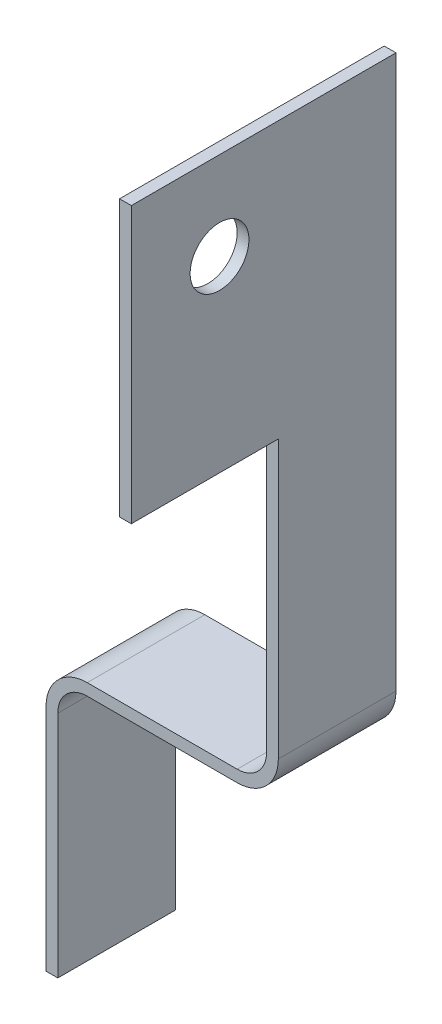
ISO-10303-21;
HEADER;
FILE_DESCRIPTION(('STEP AP214'),'2;1');
FILE_NAME('part.step','',(''),(''),'','','');
FILE_SCHEMA(('AUTOMOTIVE_DESIGN { 1 0 10303 214 1 1 1 1 }'));
ENDSEC;
DATA;
#1=APPLICATION_CONTEXT('core data for automotive mechanical design processes');
#2=APPLICATION_PROTOCOL_DEFINITION('international standard','automotive_design',2000,#1);
#3=PRODUCT_CONTEXT('',#1,'mechanical');
#4=PRODUCT('Part','Part','',(#3));
#5=PRODUCT_RELATED_PRODUCT_CATEGORY('part','',(#4));
#6=PRODUCT_DEFINITION_FORMATION('','',#4);
#7=PRODUCT_DEFINITION_CONTEXT('part definition',#1,'design');
#8=PRODUCT_DEFINITION('design','',#6,#7);
#9=PRODUCT_DEFINITION_SHAPE('','',#8);
#10=(LENGTH_UNIT() NAMED_UNIT(*) SI_UNIT(.MILLI.,.METRE.));
#11=(NAMED_UNIT(*) PLANE_ANGLE_UNIT() SI_UNIT($,.RADIAN.));
#12=(NAMED_UNIT(*) SI_UNIT($,.STERADIAN.) SOLID_ANGLE_UNIT());
#13=UNCERTAINTY_MEASURE_WITH_UNIT(LENGTH_MEASURE(1.E-05),#10,'distance_accuracy_value','');
#14=(GEOMETRIC_REPRESENTATION_CONTEXT(3) GLOBAL_UNCERTAINTY_ASSIGNED_CONTEXT((#13)) GLOBAL_UNIT_ASSIGNED_CONTEXT((#10,
#11,#12)) REPRESENTATION_CONTEXT('',''));
#15=CARTESIAN_POINT('',(0.,0.,0.));
#16=DIRECTION('',(0.,0.,1.));
#17=DIRECTION('',(1.,0.,0.));
#18=AXIS2_PLACEMENT_3D('',#15,#16,#17);
#19=CARTESIAN_POINT('',(159.6,15.6281292110205,301.02952490883));
#20=DIRECTION('',(0.,0.,-1.));
#21=DIRECTION('',(-1.,0.,0.));
#22=AXIS2_PLACEMENT_3D('',#19,#20,#21);
#23=PLANE('',#22);
#24=DIRECTION('',(-1.,0.,0.));
#25=VECTOR('',#24,1.);
#26=CARTESIAN_POINT('',(175.4,33.2281292110205,301.02952490883));
#27=LINE('',#26,#25);
#28=CARTESIAN_POINT('',(172.6,33.2281292110205,301.02952490883));
#29=VERTEX_POINT('',#28);
#30=CARTESIAN_POINT('',(162.4,33.2281292110205,301.02952490883));
#31=VERTEX_POINT('',#30);
#32=EDGE_CURVE('E327',#29,#31,#27,.T.);
#33=ORIENTED_EDGE('',*,*,#32,.F.);
#34=CARTESIAN_POINT('',(172.6,36.0281292110205,301.02952490883));
#35=DIRECTION('',(0.,0.,-1.));
#36=DIRECTION('',(-1.,0.,0.));
#37=AXIS2_PLACEMENT_3D('',#34,#35,#36);
#38=CIRCLE('',#37,2.8);
#39=CARTESIAN_POINT('',(175.4,36.0281292110205,301.02952490883));
#40=VERTEX_POINT('',#39);
#41=EDGE_CURVE('E52',#29,#40,#38,.F.);
#42=ORIENTED_EDGE('',*,*,#41,.T.);
#43=DIRECTION('',(0.,-1.,0.));
#44=VECTOR('',#43,1.);
#45=CARTESIAN_POINT('',(175.4,73.6281292110205,301.02952490883));
#46=LINE('',#45,#44);
#47=CARTESIAN_POINT('',(175.4,54.8829170132726,301.02952490883));
#48=VERTEX_POINT('',#47);
#49=EDGE_CURVE('E176',#48,#40,#46,.T.);
#50=ORIENTED_EDGE('',*,*,#49,.F.);
#51=DIRECTION('',(1.,0.,0.));
#52=VECTOR('',#51,1.);
#53=CARTESIAN_POINT('',(175.4,54.8829170132726,301.02952490883));
#54=LINE('',#53,#52);
#55=CARTESIAN_POINT('',(174.6,54.8829170132726,301.02952490883));
#56=VERTEX_POINT('',#55);
#57=EDGE_CURVE('E150',#56,#48,#54,.T.);
#58=ORIENTED_EDGE('',*,*,#57,.F.);
#59=DIRECTION('',(0.,-1.,0.));
#60=VECTOR('',#59,1.);
#61=CARTESIAN_POINT('',(174.6,73.6281292110205,301.02952490883));
#62=LINE('',#61,#60);
#63=CARTESIAN_POINT('',(174.6,36.0281292110205,301.02952490883));
#64=VERTEX_POINT('',#63);
#65=EDGE_CURVE('E177',#56,#64,#62,.T.);
#66=ORIENTED_EDGE('',*,*,#65,.T.);
#67=CARTESIAN_POINT('',(172.6,36.0281292110205,301.02952490883));
#68=DIRECTION('',(0.,0.,-1.));
#69=DIRECTION('',(-1.,0.,0.));
#70=AXIS2_PLACEMENT_3D('',#67,#68,#69);
#71=CIRCLE('',#70,2.);
#72=CARTESIAN_POINT('',(172.6,34.0281292110205,301.02952490883));
#73=VERTEX_POINT('',#72);
#74=EDGE_CURVE('E222',#64,#73,#71,.T.);
#75=ORIENTED_EDGE('',*,*,#74,.T.);
#76=DIRECTION('',(-1.,0.,0.));
#77=VECTOR('',#76,1.);
#78=CARTESIAN_POINT('',(174.6,34.0281292110205,301.02952490883));
#79=LINE('',#78,#77);
#80=CARTESIAN_POINT('',(162.4,34.0281292110205,301.02952490883));
#81=VERTEX_POINT('',#80);
#82=EDGE_CURVE('E161',#73,#81,#79,.T.);
#83=ORIENTED_EDGE('',*,*,#82,.T.);
#84=CARTESIAN_POINT('',(162.4,31.2281292110205,301.02952490883));
#85=DIRECTION('',(0.,0.,-1.));
#86=DIRECTION('',(-1.,0.,0.));
#87=AXIS2_PLACEMENT_3D('',#84,#85,#86);
#88=CIRCLE('',#87,2.8);
#89=CARTESIAN_POINT('',(159.6,31.2281292110205,301.02952490883));
#90=VERTEX_POINT('',#89);
#91=EDGE_CURVE('E214',#81,#90,#88,.F.);
#92=ORIENTED_EDGE('',*,*,#91,.T.);
#93=DIRECTION('',(0.,1.,0.));
#94=VECTOR('',#93,1.);
#95=CARTESIAN_POINT('',(159.6,15.6281292110205,301.02952490883));
#96=LINE('',#95,#94);
#97=CARTESIAN_POINT('',(159.6,15.6281292110205,301.02952490883));
#98=VERTEX_POINT('',#97);
#99=EDGE_CURVE('E196',#98,#90,#96,.T.);
#100=ORIENTED_EDGE('',*,*,#99,.F.);
#101=DIRECTION('',(-1.,0.,0.));
#102=VECTOR('',#101,1.);
#103=CARTESIAN_POINT('',(175.4,15.6281292110205,301.02952490883));
#104=LINE('',#103,#102);
#105=CARTESIAN_POINT('',(160.4,15.6281292110205,301.02952490883));
#106=VERTEX_POINT('',#105);
#107=EDGE_CURVE('E170',#106,#98,#104,.T.);
#108=ORIENTED_EDGE('',*,*,#107,.F.);
#109=DIRECTION('',(0.,-1.,0.));
#110=VECTOR('',#109,1.);
#111=CARTESIAN_POINT('',(160.4,33.2281292110205,301.02952490883));
#112=LINE('',#111,#110);
#113=CARTESIAN_POINT('',(160.4,31.2281292110205,301.02952490883));
#114=VERTEX_POINT('',#113);
#115=EDGE_CURVE('E147',#114,#106,#112,.T.);
#116=ORIENTED_EDGE('',*,*,#115,.F.);
#117=CARTESIAN_POINT('',(162.4,31.2281292110205,301.02952490883));
#118=DIRECTION('',(0.,0.,-1.));
#119=DIRECTION('',(-1.,0.,0.));
#120=AXIS2_PLACEMENT_3D('',#117,#118,#119);
#121=CIRCLE('',#120,2.);
#122=EDGE_CURVE('E232',#114,#31,#121,.T.);
#123=ORIENTED_EDGE('',*,*,#122,.T.);
#124=EDGE_LOOP('',(#33,#42,#50,#58,#66,#75,#83,#92,#100,#108,#116,#123));
#125=FACE_BOUND('',#124,.T.);
#126=ADVANCED_FACE('F30',(#125),#23,.F.);
#127=CARTESIAN_POINT('',(175.4,15.6281292110205,301.02952490883));
#128=DIRECTION('',(0.,-1.,0.));
#129=DIRECTION('',(0.,0.,-1.));
#130=AXIS2_PLACEMENT_3D('',#127,#128,#129);
#131=PLANE('',#130);
#132=DIRECTION('',(0.,0.,1.));
#133=VECTOR('',#132,1.);
#134=CARTESIAN_POINT('',(160.4,15.6281292110205,293.02952490883));
#135=LINE('',#134,#133);
#136=CARTESIAN_POINT('',(160.4,15.6281292110205,293.02952490883));
#137=VERTEX_POINT('',#136);
#138=EDGE_CURVE('E141',#137,#106,#135,.T.);
#139=ORIENTED_EDGE('',*,*,#138,.T.);
#140=ORIENTED_EDGE('',*,*,#107,.T.);
#141=DIRECTION('',(0.,0.,-1.));
#142=VECTOR('',#141,1.);
#143=CARTESIAN_POINT('',(159.6,15.6281292110205,301.02952490883));
#144=LINE('',#143,#142);
#145=CARTESIAN_POINT('',(159.6,15.6281292110205,293.02952490883));
#146=VERTEX_POINT('',#145);
#147=EDGE_CURVE('E154',#98,#146,#144,.T.);
#148=ORIENTED_EDGE('',*,*,#147,.T.);
#149=DIRECTION('',(-1.,0.,0.));
#150=VECTOR('',#149,1.);
#151=CARTESIAN_POINT('',(175.4,15.6281292110205,293.02952490883));
#152=LINE('',#151,#150);
#153=EDGE_CURVE('E134',#137,#146,#152,.T.);
#154=ORIENTED_EDGE('',*,*,#153,.F.);
#155=EDGE_LOOP('',(#139,#140,#148,#154));
#156=FACE_BOUND('',#155,.T.);
#157=ADVANCED_FACE('F152',(#156),#131,.T.);
#158=CARTESIAN_POINT('',(175.4,73.6281292110205,301.02952490883));
#159=DIRECTION('',(1.,0.,0.));
#160=DIRECTION('',(0.,0.,-1.));
#161=AXIS2_PLACEMENT_3D('',#158,#159,#160);
#162=PLANE('',#161);
#163=CARTESIAN_POINT('',(175.4,67.6281292110205,305.02952490883));
#164=DIRECTION('',(1.,0.,0.));
#165=DIRECTION('',(0.,0.,-1.));
#166=AXIS2_PLACEMENT_3D('',#163,#164,#165);
#167=CIRCLE('',#166,2.00000000000002);
#168=CARTESIAN_POINT('',(175.4,67.6281292110205,303.02952490883));
#169=VERTEX_POINT('',#168);
#170=EDGE_CURVE('E329',#169,#169,#167,.T.);
#171=ORIENTED_EDGE('',*,*,#170,.F.);
#172=EDGE_LOOP('',(#171));
#173=FACE_BOUND('',#172,.T.);
#174=ORIENTED_EDGE('',*,*,#49,.T.);
#175=DIRECTION('',(0.,0.,1.));
#176=VECTOR('',#175,1.);
#177=CARTESIAN_POINT('',(175.4,36.0281292110205,293.02952490883));
#178=LINE('',#177,#176);
#179=CARTESIAN_POINT('',(175.4,36.0281292110205,293.02952490883));
#180=VERTEX_POINT('',#179);
#181=EDGE_CURVE('E38',#40,#180,#178,.F.);
#182=ORIENTED_EDGE('',*,*,#181,.T.);
#183=DIRECTION('',(0.,-1.,0.));
#184=VECTOR('',#183,1.);
#185=CARTESIAN_POINT('',(175.4,73.6281292110205,293.02952490883));
#186=LINE('',#185,#184);
#187=CARTESIAN_POINT('',(175.4,73.6281292110205,293.02952490883));
#188=VERTEX_POINT('',#187);
#189=EDGE_CURVE('E168',#188,#180,#186,.T.);
#190=ORIENTED_EDGE('',*,*,#189,.F.);
#191=DIRECTION('',(0.,0.,-1.));
#192=VECTOR('',#191,1.);
#193=CARTESIAN_POINT('',(175.4,73.6281292110205,301.02952490883));
#194=LINE('',#193,#192);
#195=CARTESIAN_POINT('',(175.4,73.6281292110205,311.02952490883));
#196=VERTEX_POINT('',#195);
#197=EDGE_CURVE('E171',#196,#188,#194,.T.);
#198=ORIENTED_EDGE('',*,*,#197,.F.);
#199=DIRECTION('',(0.,1.,0.));
#200=VECTOR('',#199,1.);
#201=CARTESIAN_POINT('',(175.4,73.6281292110205,311.02952490883));
#202=LINE('',#201,#200);
#203=CARTESIAN_POINT('',(175.4,54.8829170132726,311.02952490883));
#204=VERTEX_POINT('',#203);
#205=EDGE_CURVE('E250',#204,#196,#202,.T.);
#206=ORIENTED_EDGE('',*,*,#205,.F.);
#207=DIRECTION('',(0.,0.,-1.));
#208=VECTOR('',#207,1.);
#209=CARTESIAN_POINT('',(175.4,54.8829170132726,311.02952490883));
#210=LINE('',#209,#208);
#211=EDGE_CURVE('E193',#204,#48,#210,.T.);
#212=ORIENTED_EDGE('',*,*,#211,.T.);
#213=EDGE_LOOP('',(#174,#182,#190,#198,#206,#212));
#214=FACE_BOUND('',#213,.T.);
#215=ADVANCED_FACE('F203',(#173,#214),#162,.T.);
#216=CARTESIAN_POINT('',(159.6,73.6281292110205,301.02952490883));
#217=DIRECTION('',(0.,1.,0.));
#218=DIRECTION('',(0.,0.,1.));
#219=AXIS2_PLACEMENT_3D('',#216,#217,#218);
#220=PLANE('',#219);
#221=DIRECTION('',(0.,0.,-1.));
#222=VECTOR('',#221,1.);
#223=CARTESIAN_POINT('',(174.6,73.6281292110205,301.02952490883));
#224=LINE('',#223,#222);
#225=CARTESIAN_POINT('',(174.6,73.6281292110205,311.02952490883));
#226=VERTEX_POINT('',#225);
#227=CARTESIAN_POINT('',(174.6,73.6281292110205,293.02952490883));
#228=VERTEX_POINT('',#227);
#229=EDGE_CURVE('E157',#226,#228,#224,.T.);
#230=ORIENTED_EDGE('',*,*,#229,.F.);
#231=DIRECTION('',(-1.,0.,0.));
#232=VECTOR('',#231,1.);
#233=CARTESIAN_POINT('',(174.6,73.6281292110205,311.02952490883));
#234=LINE('',#233,#232);
#235=EDGE_CURVE('E255',#196,#226,#234,.T.);
#236=ORIENTED_EDGE('',*,*,#235,.F.);
#237=ORIENTED_EDGE('',*,*,#197,.T.);
#238=DIRECTION('',(1.,0.,0.));
#239=VECTOR('',#238,1.);
#240=CARTESIAN_POINT('',(159.6,73.6281292110205,293.02952490883));
#241=LINE('',#240,#239);
#242=EDGE_CURVE('E159',#228,#188,#241,.T.);
#243=ORIENTED_EDGE('',*,*,#242,.F.);
#244=EDGE_LOOP('',(#230,#236,#237,#243));
#245=FACE_BOUND('',#244,.T.);
#246=ADVANCED_FACE('F291',(#245),#220,.T.);
#247=CARTESIAN_POINT('',(159.6,15.6281292110205,301.02952490883));
#248=DIRECTION('',(-1.,0.,0.));
#249=DIRECTION('',(0.,-1.,0.));
#250=AXIS2_PLACEMENT_3D('',#247,#248,#249);
#251=PLANE('',#250);
#252=ORIENTED_EDGE('',*,*,#99,.T.);
#253=DIRECTION('',(0.,0.,-1.));
#254=VECTOR('',#253,1.);
#255=CARTESIAN_POINT('',(159.6,31.2281292110205,293.02952490883));
#256=LINE('',#255,#254);
#257=CARTESIAN_POINT('',(159.6,31.2281292110205,293.02952490883));
#258=VERTEX_POINT('',#257);
#259=EDGE_CURVE('E220',#90,#258,#256,.T.);
#260=ORIENTED_EDGE('',*,*,#259,.T.);
#261=DIRECTION('',(0.,1.,0.));
#262=VECTOR('',#261,1.);
#263=CARTESIAN_POINT('',(159.6,15.6281292110205,293.02952490883));
#264=LINE('',#263,#262);
#265=EDGE_CURVE('E156',#146,#258,#264,.T.);
#266=ORIENTED_EDGE('',*,*,#265,.F.);
#267=ORIENTED_EDGE('',*,*,#147,.F.);
#268=EDGE_LOOP('',(#252,#260,#266,#267));
#269=FACE_BOUND('',#268,.T.);
#270=ADVANCED_FACE('F288',(#269),#251,.T.);
#271=CARTESIAN_POINT('',(159.6,15.6281292110205,293.02952490883));
#272=DIRECTION('',(0.,0.,-1.));
#273=DIRECTION('',(-1.,0.,0.));
#274=AXIS2_PLACEMENT_3D('',#271,#272,#273);
#275=PLANE('',#274);
#276=ORIENTED_EDGE('',*,*,#189,.T.);
#277=CARTESIAN_POINT('',(172.6,36.0281292110205,293.02952490883));
#278=DIRECTION('',(0.,0.,-1.));
#279=DIRECTION('',(-1.,0.,0.));
#280=AXIS2_PLACEMENT_3D('',#277,#278,#279);
#281=CIRCLE('',#280,2.8);
#282=CARTESIAN_POINT('',(172.6,33.2281292110205,293.02952490883));
#283=VERTEX_POINT('',#282);
#284=EDGE_CURVE('E11',#180,#283,#281,.T.);
#285=ORIENTED_EDGE('',*,*,#284,.T.);
#286=DIRECTION('',(-1.,0.,0.));
#287=VECTOR('',#286,1.);
#288=CARTESIAN_POINT('',(175.4,33.2281292110205,293.02952490883));
#289=LINE('',#288,#287);
#290=CARTESIAN_POINT('',(162.4,33.2281292110205,293.02952490883));
#291=VERTEX_POINT('',#290);
#292=EDGE_CURVE('E142',#283,#291,#289,.T.);
#293=ORIENTED_EDGE('',*,*,#292,.T.);
#294=CARTESIAN_POINT('',(162.4,31.2281292110205,293.02952490883));
#295=DIRECTION('',(0.,0.,-1.));
#296=DIRECTION('',(-1.,0.,0.));
#297=AXIS2_PLACEMENT_3D('',#294,#295,#296);
#298=CIRCLE('',#297,2.);
#299=CARTESIAN_POINT('',(160.4,31.2281292110205,293.02952490883));
#300=VERTEX_POINT('',#299);
#301=EDGE_CURVE('E137',#291,#300,#298,.F.);
#302=ORIENTED_EDGE('',*,*,#301,.T.);
#303=DIRECTION('',(0.,-1.,0.));
#304=VECTOR('',#303,1.);
#305=CARTESIAN_POINT('',(160.4,33.2281292110205,293.02952490883));
#306=LINE('',#305,#304);
#307=EDGE_CURVE('E129',#300,#137,#306,.T.);
#308=ORIENTED_EDGE('',*,*,#307,.T.);
#309=ORIENTED_EDGE('',*,*,#153,.T.);
#310=ORIENTED_EDGE('',*,*,#265,.T.);
#311=CARTESIAN_POINT('',(162.4,31.2281292110205,293.02952490883));
#312=DIRECTION('',(0.,0.,-1.));
#313=DIRECTION('',(-1.,0.,0.));
#314=AXIS2_PLACEMENT_3D('',#311,#312,#313);
#315=CIRCLE('',#314,2.8);
#316=CARTESIAN_POINT('',(162.4,34.0281292110205,293.02952490883));
#317=VERTEX_POINT('',#316);
#318=EDGE_CURVE('E218',#258,#317,#315,.T.);
#319=ORIENTED_EDGE('',*,*,#318,.T.);
#320=DIRECTION('',(-1.,0.,0.));
#321=VECTOR('',#320,1.);
#322=CARTESIAN_POINT('',(174.6,34.0281292110205,293.02952490883));
#323=LINE('',#322,#321);
#324=CARTESIAN_POINT('',(172.6,34.0281292110205,293.02952490883));
#325=VERTEX_POINT('',#324);
#326=EDGE_CURVE('E181',#325,#317,#323,.T.);
#327=ORIENTED_EDGE('',*,*,#326,.F.);
#328=CARTESIAN_POINT('',(172.6,36.0281292110205,293.02952490883));
#329=DIRECTION('',(0.,0.,-1.));
#330=DIRECTION('',(-1.,0.,0.));
#331=AXIS2_PLACEMENT_3D('',#328,#329,#330);
#332=CIRCLE('',#331,2.);
#333=CARTESIAN_POINT('',(174.6,36.0281292110205,293.02952490883));
#334=VERTEX_POINT('',#333);
#335=EDGE_CURVE('E224',#325,#334,#332,.F.);
#336=ORIENTED_EDGE('',*,*,#335,.T.);
#337=DIRECTION('',(0.,-1.,0.));
#338=VECTOR('',#337,1.);
#339=CARTESIAN_POINT('',(174.6,73.6281292110205,293.02952490883));
#340=LINE('',#339,#338);
#341=EDGE_CURVE('E190',#228,#334,#340,.T.);
#342=ORIENTED_EDGE('',*,*,#341,.F.);
#343=ORIENTED_EDGE('',*,*,#242,.T.);
#344=EDGE_LOOP('',(#276,#285,#293,#302,#308,#309,#310,#319,#327,#336,#342,#343));
#345=FACE_BOUND('',#344,.T.);
#346=ADVANCED_FACE('F131',(#345),#275,.T.);
#347=CARTESIAN_POINT('',(174.6,34.0281292110205,301.02952490883));
#348=DIRECTION('',(0.,-1.,0.));
#349=DIRECTION('',(1.,0.,0.));
#350=AXIS2_PLACEMENT_3D('',#347,#348,#349);
#351=PLANE('',#350);
#352=ORIENTED_EDGE('',*,*,#326,.T.);
#353=DIRECTION('',(0.,0.,-1.));
#354=VECTOR('',#353,1.);
#355=CARTESIAN_POINT('',(162.4,34.0281292110205,301.02952490883));
#356=LINE('',#355,#354);
#357=EDGE_CURVE('E216',#317,#81,#356,.F.);
#358=ORIENTED_EDGE('',*,*,#357,.T.);
#359=ORIENTED_EDGE('',*,*,#82,.F.);
#360=DIRECTION('',(0.,0.,-1.));
#361=VECTOR('',#360,1.);
#362=CARTESIAN_POINT('',(172.6,34.0281292110205,293.02952490883));
#363=LINE('',#362,#361);
#364=EDGE_CURVE('E228',#73,#325,#363,.T.);
#365=ORIENTED_EDGE('',*,*,#364,.T.);
#366=EDGE_LOOP('',(#352,#358,#359,#365));
#367=FACE_BOUND('',#366,.T.);
#368=ADVANCED_FACE('F275',(#367),#351,.F.);
#369=CARTESIAN_POINT('',(174.6,73.6281292110205,301.02952490883));
#370=DIRECTION('',(1.,0.,0.));
#371=DIRECTION('',(0.,0.,-1.));
#372=AXIS2_PLACEMENT_3D('',#369,#370,#371);
#373=PLANE('',#372);
#374=CARTESIAN_POINT('',(174.6,67.6281292110205,305.02952490883));
#375=DIRECTION('',(-1.,0.,0.));
#376=DIRECTION('',(0.,0.,1.));
#377=AXIS2_PLACEMENT_3D('',#374,#375,#376);
#378=CIRCLE('',#377,2.00000000000002);
#379=CARTESIAN_POINT('',(174.6,67.6281292110205,307.02952490883));
#380=VERTEX_POINT('',#379);
#381=EDGE_CURVE('E333',#380,#380,#378,.T.);
#382=ORIENTED_EDGE('',*,*,#381,.F.);
#383=EDGE_LOOP('',(#382));
#384=FACE_BOUND('',#383,.T.);
#385=ORIENTED_EDGE('',*,*,#341,.T.);
#386=DIRECTION('',(0.,0.,-1.));
#387=VECTOR('',#386,1.);
#388=CARTESIAN_POINT('',(174.6,36.0281292110205,301.02952490883));
#389=LINE('',#388,#387);
#390=EDGE_CURVE('E226',#334,#64,#389,.F.);
#391=ORIENTED_EDGE('',*,*,#390,.T.);
#392=ORIENTED_EDGE('',*,*,#65,.F.);
#393=DIRECTION('',(0.,0.,-1.));
#394=VECTOR('',#393,1.);
#395=CARTESIAN_POINT('',(174.6,54.8829170132726,311.02952490883));
#396=LINE('',#395,#394);
#397=CARTESIAN_POINT('',(174.6,54.8829170132726,311.02952490883));
#398=VERTEX_POINT('',#397);
#399=EDGE_CURVE('E241',#398,#56,#396,.T.);
#400=ORIENTED_EDGE('',*,*,#399,.F.);
#401=DIRECTION('',(0.,-1.,0.));
#402=VECTOR('',#401,1.);
#403=CARTESIAN_POINT('',(174.6,54.8829170132726,311.02952490883));
#404=LINE('',#403,#402);
#405=EDGE_CURVE('E244',#226,#398,#404,.T.);
#406=ORIENTED_EDGE('',*,*,#405,.F.);
#407=ORIENTED_EDGE('',*,*,#229,.T.);
#408=EDGE_LOOP('',(#385,#391,#392,#400,#406,#407));
#409=FACE_BOUND('',#408,.T.);
#410=ADVANCED_FACE('F266',(#384,#409),#373,.F.);
#411=CARTESIAN_POINT('',(175.4,54.8829170132726,311.02952490883));
#412=DIRECTION('',(0.,1.,0.));
#413=DIRECTION('',(0.,0.,1.));
#414=AXIS2_PLACEMENT_3D('',#411,#412,#413);
#415=PLANE('',#414);
#416=ORIENTED_EDGE('',*,*,#57,.T.);
#417=ORIENTED_EDGE('',*,*,#211,.F.);
#418=DIRECTION('',(1.,0.,0.));
#419=VECTOR('',#418,1.);
#420=CARTESIAN_POINT('',(175.4,54.8829170132726,311.02952490883));
#421=LINE('',#420,#419);
#422=EDGE_CURVE('E246',#398,#204,#421,.T.);
#423=ORIENTED_EDGE('',*,*,#422,.F.);
#424=ORIENTED_EDGE('',*,*,#399,.T.);
#425=EDGE_LOOP('',(#416,#417,#423,#424));
#426=FACE_BOUND('',#425,.T.);
#427=ADVANCED_FACE('F267',(#426),#415,.F.);
#428=CARTESIAN_POINT('',(174.6,54.8829170132726,311.02952490883));
#429=DIRECTION('',(0.,0.,-1.));
#430=DIRECTION('',(-1.,0.,0.));
#431=AXIS2_PLACEMENT_3D('',#428,#429,#430);
#432=PLANE('',#431);
#433=ORIENTED_EDGE('',*,*,#422,.T.);
#434=ORIENTED_EDGE('',*,*,#205,.T.);
#435=ORIENTED_EDGE('',*,*,#235,.T.);
#436=ORIENTED_EDGE('',*,*,#405,.T.);
#437=EDGE_LOOP('',(#433,#434,#435,#436));
#438=FACE_BOUND('',#437,.T.);
#439=ADVANCED_FACE('F262',(#438),#432,.F.);
#440=CARTESIAN_POINT('',(160.4,33.2281292110205,293.02952490883));
#441=DIRECTION('',(-1.,0.,0.));
#442=DIRECTION('',(0.,0.,1.));
#443=AXIS2_PLACEMENT_3D('',#440,#441,#442);
#444=PLANE('',#443);
#445=ORIENTED_EDGE('',*,*,#307,.F.);
#446=DIRECTION('',(0.,0.,1.));
#447=VECTOR('',#446,1.);
#448=CARTESIAN_POINT('',(160.4,31.2281292110205,301.02952490883));
#449=LINE('',#448,#447);
#450=EDGE_CURVE('E174',#300,#114,#449,.T.);
#451=ORIENTED_EDGE('',*,*,#450,.T.);
#452=ORIENTED_EDGE('',*,*,#115,.T.);
#453=ORIENTED_EDGE('',*,*,#138,.F.);
#454=EDGE_LOOP('',(#445,#451,#452,#453));
#455=FACE_BOUND('',#454,.T.);
#456=ADVANCED_FACE('F145',(#455),#444,.F.);
#457=CARTESIAN_POINT('',(175.4,33.2281292110205,293.02952490883));
#458=DIRECTION('',(0.,1.,0.));
#459=DIRECTION('',(-1.,0.,0.));
#460=AXIS2_PLACEMENT_3D('',#457,#458,#459);
#461=PLANE('',#460);
#462=ORIENTED_EDGE('',*,*,#292,.F.);
#463=DIRECTION('',(0.,0.,1.));
#464=VECTOR('',#463,1.);
#465=CARTESIAN_POINT('',(172.6,33.2281292110205,301.02952490883));
#466=LINE('',#465,#464);
#467=EDGE_CURVE('E210',#283,#29,#466,.T.);
#468=ORIENTED_EDGE('',*,*,#467,.T.);
#469=ORIENTED_EDGE('',*,*,#32,.T.);
#470=DIRECTION('',(0.,0.,1.));
#471=VECTOR('',#470,1.);
#472=CARTESIAN_POINT('',(162.4,33.2281292110205,293.02952490883));
#473=LINE('',#472,#471);
#474=EDGE_CURVE('E235',#31,#291,#473,.F.);
#475=ORIENTED_EDGE('',*,*,#474,.T.);
#476=EDGE_LOOP('',(#462,#468,#469,#475));
#477=FACE_BOUND('',#476,.T.);
#478=ADVANCED_FACE('F324',(#477),#461,.F.);
#479=CARTESIAN_POINT('',(174.6,67.6281292110205,305.02952490883));
#480=DIRECTION('',(-1.,0.,0.));
#481=DIRECTION('',(0.,0.,1.));
#482=AXIS2_PLACEMENT_3D('',#479,#480,#481);
#483=CYLINDRICAL_SURFACE('',#482,2.00000000000002);
#484=ORIENTED_EDGE('',*,*,#170,.T.);
#485=EDGE_LOOP('',(#484));
#486=FACE_BOUND('',#485,.T.);
#487=ORIENTED_EDGE('',*,*,#381,.T.);
#488=EDGE_LOOP('',(#487));
#489=FACE_BOUND('',#488,.T.);
#490=ADVANCED_FACE('F302',(#486,#489),#483,.F.);
#491=CARTESIAN_POINT('',(162.4,31.2281292110205,293.02952490883));
#492=DIRECTION('',(0.,0.,-1.));
#493=DIRECTION('',(-1.,0.,0.));
#494=AXIS2_PLACEMENT_3D('',#491,#492,#493);
#495=CYLINDRICAL_SURFACE('',#494,2.);
#496=ORIENTED_EDGE('',*,*,#301,.F.);
#497=ORIENTED_EDGE('',*,*,#474,.F.);
#498=ORIENTED_EDGE('',*,*,#122,.F.);
#499=ORIENTED_EDGE('',*,*,#450,.F.);
#500=EDGE_LOOP('',(#496,#497,#498,#499));
#501=FACE_BOUND('',#500,.T.);
#502=ADVANCED_FACE('F298',(#501),#495,.F.);
#503=CARTESIAN_POINT('',(172.6,36.0281292110205,301.02952490883));
#504=DIRECTION('',(0.,0.,1.));
#505=DIRECTION('',(1.,0.,0.));
#506=AXIS2_PLACEMENT_3D('',#503,#504,#505);
#507=CYLINDRICAL_SURFACE('',#506,2.);
#508=ORIENTED_EDGE('',*,*,#74,.F.);
#509=ORIENTED_EDGE('',*,*,#390,.F.);
#510=ORIENTED_EDGE('',*,*,#335,.F.);
#511=ORIENTED_EDGE('',*,*,#364,.F.);
#512=EDGE_LOOP('',(#508,#509,#510,#511));
#513=FACE_BOUND('',#512,.T.);
#514=ADVANCED_FACE('F301',(#513),#507,.F.);
#515=CARTESIAN_POINT('',(162.4,31.2281292110205,301.02952490883));
#516=DIRECTION('',(0.,0.,1.));
#517=DIRECTION('',(1.,0.,0.));
#518=AXIS2_PLACEMENT_3D('',#515,#516,#517);
#519=CYLINDRICAL_SURFACE('',#518,2.8);
#520=ORIENTED_EDGE('',*,*,#91,.F.);
#521=ORIENTED_EDGE('',*,*,#357,.F.);
#522=ORIENTED_EDGE('',*,*,#318,.F.);
#523=ORIENTED_EDGE('',*,*,#259,.F.);
#524=EDGE_LOOP('',(#520,#521,#522,#523));
#525=FACE_BOUND('',#524,.T.);
#526=ADVANCED_FACE('F305',(#525),#519,.T.);
#527=CARTESIAN_POINT('',(172.6,36.0281292110205,293.02952490883));
#528=DIRECTION('',(0.,0.,-1.));
#529=DIRECTION('',(-1.,0.,0.));
#530=AXIS2_PLACEMENT_3D('',#527,#528,#529);
#531=CYLINDRICAL_SURFACE('',#530,2.8);
#532=ORIENTED_EDGE('',*,*,#284,.F.);
#533=ORIENTED_EDGE('',*,*,#181,.F.);
#534=ORIENTED_EDGE('',*,*,#41,.F.);
#535=ORIENTED_EDGE('',*,*,#467,.F.);
#536=EDGE_LOOP('',(#532,#533,#534,#535));
#537=FACE_BOUND('',#536,.T.);
#538=ADVANCED_FACE('F32',(#537),#531,.T.);
#539=CLOSED_SHELL('',(#126,#157,#215,#246,#270,#346,#368,#410,#427,#439,#456,#478,#490,#502,
#514,#526,#538));
#540=MANIFOLD_SOLID_BREP('B2',#539);
#541=ADVANCED_BREP_SHAPE_REPRESENTATION('',(#18,#540),#14);
#542=SHAPE_DEFINITION_REPRESENTATION(#9,#541);
ENDSEC;
END-ISO-10303-21;
